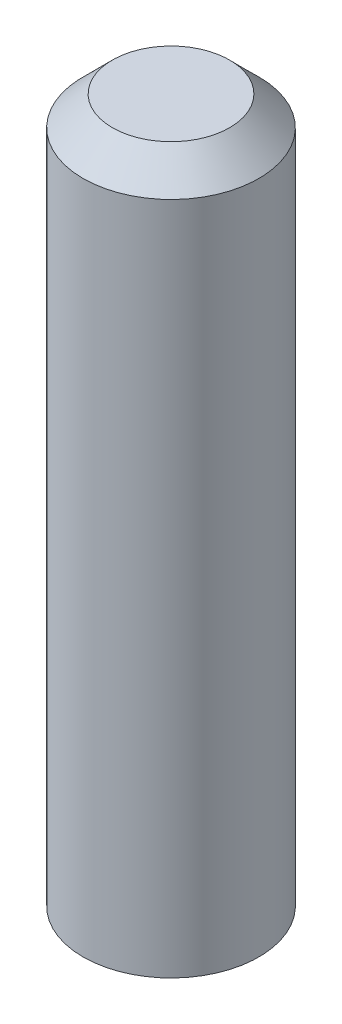
ISO-10303-21;
HEADER;
FILE_DESCRIPTION(('STEP AP214'),'2;1');
FILE_NAME('part.step','',(''),(''),'','','');
FILE_SCHEMA(('AUTOMOTIVE_DESIGN { 1 0 10303 214 1 1 1 1 }'));
ENDSEC;
DATA;
#1=APPLICATION_CONTEXT('core data for automotive mechanical design processes');
#2=APPLICATION_PROTOCOL_DEFINITION('international standard','automotive_design',2000,#1);
#3=PRODUCT_CONTEXT('',#1,'mechanical');
#4=PRODUCT('Part','Part','',(#3));
#5=PRODUCT_RELATED_PRODUCT_CATEGORY('part','',(#4));
#6=PRODUCT_DEFINITION_FORMATION('','',#4);
#7=PRODUCT_DEFINITION_CONTEXT('part definition',#1,'design');
#8=PRODUCT_DEFINITION('design','',#6,#7);
#9=PRODUCT_DEFINITION_SHAPE('','',#8);
#10=(LENGTH_UNIT() NAMED_UNIT(*) SI_UNIT(.MILLI.,.METRE.));
#11=(NAMED_UNIT(*) PLANE_ANGLE_UNIT() SI_UNIT($,.RADIAN.));
#12=(NAMED_UNIT(*) SI_UNIT($,.STERADIAN.) SOLID_ANGLE_UNIT());
#13=UNCERTAINTY_MEASURE_WITH_UNIT(LENGTH_MEASURE(1.E-05),#10,'distance_accuracy_value','');
#14=(GEOMETRIC_REPRESENTATION_CONTEXT(3) GLOBAL_UNCERTAINTY_ASSIGNED_CONTEXT((#13)) GLOBAL_UNIT_ASSIGNED_CONTEXT((#10,
#11,#12)) REPRESENTATION_CONTEXT('',''));
#15=CARTESIAN_POINT('',(0.,0.,0.));
#16=DIRECTION('',(0.,0.,1.));
#17=DIRECTION('',(1.,0.,0.));
#18=AXIS2_PLACEMENT_3D('',#15,#16,#17);
#19=CARTESIAN_POINT('',(0.,24.,0.));
#20=DIRECTION('',(0.,-1.,0.));
#21=DIRECTION('',(0.,0.,-1.));
#22=AXIS2_PLACEMENT_3D('',#19,#20,#21);
#23=CYLINDRICAL_SURFACE('',#22,3.);
#24=CARTESIAN_POINT('',(0.,23.,0.));
#25=DIRECTION('',(0.,1.,0.));
#26=DIRECTION('',(0.,0.,1.));
#27=AXIS2_PLACEMENT_3D('',#24,#25,#26);
#28=CIRCLE('',#27,3.);
#29=CARTESIAN_POINT('',(0.,23.,3.));
#30=VERTEX_POINT('',#29);
#31=EDGE_CURVE('E11',#30,#30,#28,.F.);
#32=ORIENTED_EDGE('',*,*,#31,.T.);
#33=EDGE_LOOP('',(#32));
#34=FACE_BOUND('',#33,.T.);
#35=CARTESIAN_POINT('',(0.,0.,0.));
#36=DIRECTION('',(0.,1.,0.));
#37=DIRECTION('',(0.,0.,1.));
#38=AXIS2_PLACEMENT_3D('',#35,#36,#37);
#39=CIRCLE('',#38,3.);
#40=CARTESIAN_POINT('',(0.,0.,3.));
#41=VERTEX_POINT('',#40);
#42=EDGE_CURVE('E72',#41,#41,#39,.T.);
#43=ORIENTED_EDGE('',*,*,#42,.T.);
#44=EDGE_LOOP('',(#43));
#45=FACE_BOUND('',#44,.T.);
#46=ADVANCED_FACE('F49',(#34,#45),#23,.T.);
#47=CARTESIAN_POINT('',(0.,24.,0.));
#48=DIRECTION('',(0.,1.,0.));
#49=DIRECTION('',(0.,0.,1.));
#50=AXIS2_PLACEMENT_3D('',#47,#48,#49);
#51=PLANE('',#50);
#52=CARTESIAN_POINT('',(0.,24.,0.));
#53=DIRECTION('',(0.,1.,0.));
#54=DIRECTION('',(0.,0.,1.));
#55=AXIS2_PLACEMENT_3D('',#52,#53,#54);
#56=CIRCLE('',#55,2.);
#57=CARTESIAN_POINT('',(0.,24.,2.));
#58=VERTEX_POINT('',#57);
#59=EDGE_CURVE('E58',#58,#58,#56,.T.);
#60=ORIENTED_EDGE('',*,*,#59,.T.);
#61=EDGE_LOOP('',(#60));
#62=FACE_BOUND('',#61,.T.);
#63=ADVANCED_FACE('F84',(#62),#51,.T.);
#64=CARTESIAN_POINT('',(0.,0.,0.));
#65=DIRECTION('',(0.,1.,0.));
#66=DIRECTION('',(0.,0.,1.));
#67=AXIS2_PLACEMENT_3D('',#64,#65,#66);
#68=PLANE('',#67);
#69=CARTESIAN_POINT('',(0.,0.,0.));
#70=DIRECTION('',(0.,-1.,0.));
#71=DIRECTION('',(0.,0.,-1.));
#72=AXIS2_PLACEMENT_3D('',#69,#70,#71);
#73=CIRCLE('',#72,1.65);
#74=CARTESIAN_POINT('',(0.,0.,-1.65));
#75=VERTEX_POINT('',#74);
#76=EDGE_CURVE('E73',#75,#75,#73,.T.);
#77=ORIENTED_EDGE('',*,*,#76,.F.);
#78=EDGE_LOOP('',(#77));
#79=FACE_BOUND('',#78,.T.);
#80=ORIENTED_EDGE('',*,*,#42,.F.);
#81=EDGE_LOOP('',(#80));
#82=FACE_BOUND('',#81,.T.);
#83=ADVANCED_FACE('F87',(#79,#82),#68,.F.);
#84=CARTESIAN_POINT('',(0.,24.,0.));
#85=DIRECTION('',(0.,-1.,0.));
#86=DIRECTION('',(0.,0.,-1.));
#87=AXIS2_PLACEMENT_3D('',#84,#85,#86);
#88=CONICAL_SURFACE('',#87,2.,0.785398163397447);
#89=ORIENTED_EDGE('',*,*,#31,.F.);
#90=EDGE_LOOP('',(#89));
#91=FACE_BOUND('',#90,.T.);
#92=ORIENTED_EDGE('',*,*,#59,.F.);
#93=EDGE_LOOP('',(#92));
#94=FACE_BOUND('',#93,.T.);
#95=ADVANCED_FACE('F52',(#91,#94),#88,.T.);
#96=CARTESIAN_POINT('',(0.,6.,0.));
#97=DIRECTION('',(0.,-1.,0.));
#98=DIRECTION('',(0.,0.,-1.));
#99=AXIS2_PLACEMENT_3D('',#96,#97,#98);
#100=CONICAL_SURFACE('',#99,1.65,1.02974425867665);
#101=CARTESIAN_POINT('',(0.,6.99142002139547,0.));
#102=VERTEX_POINT('',#101);
#103=VERTEX_LOOP('',#102);
#104=FACE_BOUND('',#103,.T.);
#105=CARTESIAN_POINT('',(0.,6.,0.));
#106=DIRECTION('',(0.,-1.,0.));
#107=DIRECTION('',(0.,0.,-1.));
#108=AXIS2_PLACEMENT_3D('',#105,#106,#107);
#109=CIRCLE('',#108,1.65);
#110=CARTESIAN_POINT('',(0.,6.,-1.65));
#111=VERTEX_POINT('',#110);
#112=EDGE_CURVE('E69',#111,#111,#109,.T.);
#113=ORIENTED_EDGE('',*,*,#112,.T.);
#114=EDGE_LOOP('',(#113));
#115=FACE_BOUND('',#114,.T.);
#116=ADVANCED_FACE('F62',(#104,#115),#100,.F.);
#117=CARTESIAN_POINT('',(0.,0.,0.));
#118=DIRECTION('',(0.,-1.,0.));
#119=DIRECTION('',(0.,0.,-1.));
#120=AXIS2_PLACEMENT_3D('',#117,#118,#119);
#121=CYLINDRICAL_SURFACE('',#120,1.65);
#122=ORIENTED_EDGE('',*,*,#112,.F.);
#123=EDGE_LOOP('',(#122));
#124=FACE_BOUND('',#123,.T.);
#125=ORIENTED_EDGE('',*,*,#76,.T.);
#126=EDGE_LOOP('',(#125));
#127=FACE_BOUND('',#126,.T.);
#128=ADVANCED_FACE('F65',(#124,#127),#121,.F.);
#129=CLOSED_SHELL('',(#46,#63,#83,#95,#116,#128));
#130=MANIFOLD_SOLID_BREP('B2',#129);
#131=ADVANCED_BREP_SHAPE_REPRESENTATION('',(#18,#130),#14);
#132=SHAPE_DEFINITION_REPRESENTATION(#9,#131);
ENDSEC;
END-ISO-10303-21;
